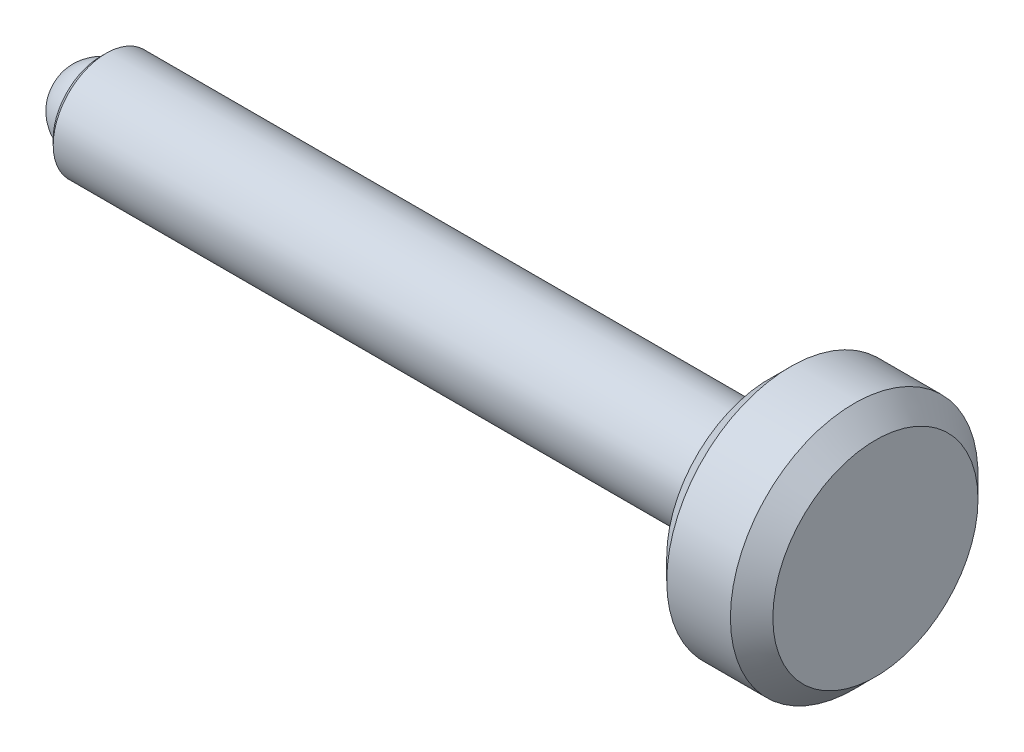
ISO-10303-21;
HEADER;
FILE_DESCRIPTION(('STEP AP214'),'2;1');
FILE_NAME('part.step','',(''),(''),'','','');
FILE_SCHEMA(('AUTOMOTIVE_DESIGN { 1 0 10303 214 1 1 1 1 }'));
ENDSEC;
DATA;
#1=APPLICATION_CONTEXT('core data for automotive mechanical design processes');
#2=APPLICATION_PROTOCOL_DEFINITION('international standard','automotive_design',2000,#1);
#3=PRODUCT_CONTEXT('',#1,'mechanical');
#4=PRODUCT('Part','Part','',(#3));
#5=PRODUCT_RELATED_PRODUCT_CATEGORY('part','',(#4));
#6=PRODUCT_DEFINITION_FORMATION('','',#4);
#7=PRODUCT_DEFINITION_CONTEXT('part definition',#1,'design');
#8=PRODUCT_DEFINITION('design','',#6,#7);
#9=PRODUCT_DEFINITION_SHAPE('','',#8);
#10=(LENGTH_UNIT() NAMED_UNIT(*) SI_UNIT(.MILLI.,.METRE.));
#11=(NAMED_UNIT(*) PLANE_ANGLE_UNIT() SI_UNIT($,.RADIAN.));
#12=(NAMED_UNIT(*) SI_UNIT($,.STERADIAN.) SOLID_ANGLE_UNIT());
#13=UNCERTAINTY_MEASURE_WITH_UNIT(LENGTH_MEASURE(1.E-05),#10,'distance_accuracy_value','');
#14=(GEOMETRIC_REPRESENTATION_CONTEXT(3) GLOBAL_UNCERTAINTY_ASSIGNED_CONTEXT((#13)) GLOBAL_UNIT_ASSIGNED_CONTEXT((#10,
#11,#12)) REPRESENTATION_CONTEXT('',''));
#15=CARTESIAN_POINT('',(0.,0.,0.));
#16=DIRECTION('',(0.,0.,1.));
#17=DIRECTION('',(1.,0.,0.));
#18=AXIS2_PLACEMENT_3D('',#15,#16,#17);
#19=CARTESIAN_POINT('',(1.1,0.,0.));
#20=DIRECTION('',(-1.,0.,0.));
#21=DIRECTION('',(0.,1.,0.));
#22=AXIS2_PLACEMENT_3D('',#19,#20,#21);
#23=SPHERICAL_SURFACE('',#22,1.1);
#24=CARTESIAN_POINT('',(1.1,0.,0.));
#25=DIRECTION('',(-1.,0.,0.));
#26=DIRECTION('',(0.,0.,1.));
#27=AXIS2_PLACEMENT_3D('',#24,#25,#26);
#28=CIRCLE('',#27,1.1);
#29=CARTESIAN_POINT('',(1.1,0.,1.1));
#30=VERTEX_POINT('',#29);
#31=EDGE_CURVE('E10',#30,#30,#28,.T.);
#32=ORIENTED_EDGE('',*,*,#31,.T.);
#33=EDGE_LOOP('',(#32));
#34=FACE_BOUND('',#33,.T.);
#35=ADVANCED_FACE('F35',(#34),#23,.T.);
#36=CARTESIAN_POINT('',(1.1,1.1,0.));
#37=DIRECTION('',(1.,0.,0.));
#38=DIRECTION('',(0.,0.,-1.));
#39=AXIS2_PLACEMENT_3D('',#36,#37,#38);
#40=PLANE('',#39);
#41=ORIENTED_EDGE('',*,*,#31,.F.);
#42=EDGE_LOOP('',(#41));
#43=FACE_BOUND('',#42,.T.);
#44=CARTESIAN_POINT('',(1.1,0.,0.));
#45=DIRECTION('',(-1.,0.,0.));
#46=DIRECTION('',(0.,0.,1.));
#47=AXIS2_PLACEMENT_3D('',#44,#45,#46);
#48=CIRCLE('',#47,1.3465);
#49=CARTESIAN_POINT('',(1.1,0.,1.3465));
#50=VERTEX_POINT('',#49);
#51=EDGE_CURVE('E41',#50,#50,#48,.T.);
#52=ORIENTED_EDGE('',*,*,#51,.T.);
#53=EDGE_LOOP('',(#52));
#54=FACE_BOUND('',#53,.T.);
#55=ADVANCED_FACE('F85',(#43,#54),#40,.F.);
#56=CARTESIAN_POINT('',(1.2535,0.,0.));
#57=DIRECTION('',(1.,0.,0.));
#58=DIRECTION('',(0.,0.,-1.));
#59=AXIS2_PLACEMENT_3D('',#56,#57,#58);
#60=CONICAL_SURFACE('',#59,1.5,0.785398163397446);
#61=ORIENTED_EDGE('',*,*,#51,.F.);
#62=EDGE_LOOP('',(#61));
#63=FACE_BOUND('',#62,.T.);
#64=CARTESIAN_POINT('',(1.2535,0.,0.));
#65=DIRECTION('',(-1.,0.,0.));
#66=DIRECTION('',(0.,0.,1.));
#67=AXIS2_PLACEMENT_3D('',#64,#65,#66);
#68=CIRCLE('',#67,1.5);
#69=CARTESIAN_POINT('',(1.2535,0.,1.5));
#70=VERTEX_POINT('',#69);
#71=EDGE_CURVE('E45',#70,#70,#68,.T.);
#72=ORIENTED_EDGE('',*,*,#71,.T.);
#73=EDGE_LOOP('',(#72));
#74=FACE_BOUND('',#73,.T.);
#75=ADVANCED_FACE('F89',(#63,#74),#60,.T.);
#76=CARTESIAN_POINT('',(23.,0.,0.));
#77=DIRECTION('',(-1.,0.,0.));
#78=DIRECTION('',(0.,0.,1.));
#79=AXIS2_PLACEMENT_3D('',#76,#77,#78);
#80=CYLINDRICAL_SURFACE('',#79,1.5);
#81=ORIENTED_EDGE('',*,*,#71,.F.);
#82=EDGE_LOOP('',(#81));
#83=FACE_BOUND('',#82,.T.);
#84=CARTESIAN_POINT('',(19.1,0.,0.));
#85=DIRECTION('',(-1.,0.,0.));
#86=DIRECTION('',(0.,0.,1.));
#87=AXIS2_PLACEMENT_3D('',#84,#85,#86);
#88=CIRCLE('',#87,1.5);
#89=CARTESIAN_POINT('',(19.1,0.,1.5));
#90=VERTEX_POINT('',#89);
#91=EDGE_CURVE('E49',#90,#90,#88,.T.);
#92=ORIENTED_EDGE('',*,*,#91,.T.);
#93=EDGE_LOOP('',(#92));
#94=FACE_BOUND('',#93,.T.);
#95=ADVANCED_FACE('F94',(#83,#94),#80,.T.);
#96=CARTESIAN_POINT('',(19.1,1.5,0.));
#97=DIRECTION('',(-1.,0.,0.));
#98=DIRECTION('',(0.,0.,1.));
#99=AXIS2_PLACEMENT_3D('',#96,#97,#98);
#100=PLANE('',#99);
#101=ORIENTED_EDGE('',*,*,#91,.F.);
#102=EDGE_LOOP('',(#101));
#103=FACE_BOUND('',#102,.T.);
#104=CARTESIAN_POINT('',(19.1,0.,0.));
#105=DIRECTION('',(-1.,0.,0.));
#106=DIRECTION('',(0.,0.,1.));
#107=AXIS2_PLACEMENT_3D('',#104,#105,#106);
#108=CIRCLE('',#107,1.3465);
#109=CARTESIAN_POINT('',(19.1,0.,1.3465));
#110=VERTEX_POINT('',#109);
#111=EDGE_CURVE('E54',#110,#110,#108,.T.);
#112=ORIENTED_EDGE('',*,*,#111,.T.);
#113=EDGE_LOOP('',(#112));
#114=FACE_BOUND('',#113,.T.);
#115=ADVANCED_FACE('F100',(#103,#114),#100,.F.);
#116=CARTESIAN_POINT('',(23.,0.,0.));
#117=DIRECTION('',(-1.,0.,0.));
#118=DIRECTION('',(0.,0.,1.));
#119=AXIS2_PLACEMENT_3D('',#116,#117,#118);
#120=CYLINDRICAL_SURFACE('',#119,1.3465);
#121=ORIENTED_EDGE('',*,*,#111,.F.);
#122=EDGE_LOOP('',(#121));
#123=FACE_BOUND('',#122,.T.);
#124=CARTESIAN_POINT('',(20.,0.,0.));
#125=DIRECTION('',(-1.,0.,0.));
#126=DIRECTION('',(0.,0.,1.));
#127=AXIS2_PLACEMENT_3D('',#124,#125,#126);
#128=CIRCLE('',#127,1.3465);
#129=CARTESIAN_POINT('',(20.,0.,1.3465));
#130=VERTEX_POINT('',#129);
#131=EDGE_CURVE('E57',#130,#130,#128,.T.);
#132=ORIENTED_EDGE('',*,*,#131,.T.);
#133=EDGE_LOOP('',(#132));
#134=FACE_BOUND('',#133,.T.);
#135=ADVANCED_FACE('F104',(#123,#134),#120,.T.);
#136=CARTESIAN_POINT('',(20.,1.3465,0.));
#137=DIRECTION('',(1.,0.,0.));
#138=DIRECTION('',(0.,0.,-1.));
#139=AXIS2_PLACEMENT_3D('',#136,#137,#138);
#140=PLANE('',#139);
#141=ORIENTED_EDGE('',*,*,#131,.F.);
#142=EDGE_LOOP('',(#141));
#143=FACE_BOUND('',#142,.T.);
#144=CARTESIAN_POINT('',(20.,0.,0.));
#145=DIRECTION('',(-1.,0.,0.));
#146=DIRECTION('',(0.,0.,1.));
#147=AXIS2_PLACEMENT_3D('',#144,#145,#146);
#148=CIRCLE('',#147,2.9);
#149=CARTESIAN_POINT('',(20.,0.,2.9));
#150=VERTEX_POINT('',#149);
#151=EDGE_CURVE('E60',#150,#150,#148,.T.);
#152=ORIENTED_EDGE('',*,*,#151,.T.);
#153=EDGE_LOOP('',(#152));
#154=FACE_BOUND('',#153,.T.);
#155=ADVANCED_FACE('F108',(#143,#154),#140,.F.);
#156=CARTESIAN_POINT('',(20.6,0.,0.));
#157=DIRECTION('',(1.,0.,0.));
#158=DIRECTION('',(0.,0.,-1.));
#159=AXIS2_PLACEMENT_3D('',#156,#157,#158);
#160=CONICAL_SURFACE('',#159,3.5,0.785398163397449);
#161=ORIENTED_EDGE('',*,*,#151,.F.);
#162=EDGE_LOOP('',(#161));
#163=FACE_BOUND('',#162,.T.);
#164=CARTESIAN_POINT('',(20.6,0.,0.));
#165=DIRECTION('',(-1.,0.,0.));
#166=DIRECTION('',(0.,0.,1.));
#167=AXIS2_PLACEMENT_3D('',#164,#165,#166);
#168=CIRCLE('',#167,3.5);
#169=CARTESIAN_POINT('',(20.6,0.,3.5));
#170=VERTEX_POINT('',#169);
#171=EDGE_CURVE('E63',#170,#170,#168,.T.);
#172=ORIENTED_EDGE('',*,*,#171,.T.);
#173=EDGE_LOOP('',(#172));
#174=FACE_BOUND('',#173,.T.);
#175=ADVANCED_FACE('F112',(#163,#174),#160,.T.);
#176=CARTESIAN_POINT('',(23.,0.,0.));
#177=DIRECTION('',(-1.,0.,0.));
#178=DIRECTION('',(0.,0.,1.));
#179=AXIS2_PLACEMENT_3D('',#176,#177,#178);
#180=CYLINDRICAL_SURFACE('',#179,3.5);
#181=ORIENTED_EDGE('',*,*,#171,.F.);
#182=EDGE_LOOP('',(#181));
#183=FACE_BOUND('',#182,.T.);
#184=CARTESIAN_POINT('',(22.4,0.,0.));
#185=DIRECTION('',(-1.,0.,0.));
#186=DIRECTION('',(0.,0.,1.));
#187=AXIS2_PLACEMENT_3D('',#184,#185,#186);
#188=CIRCLE('',#187,3.5);
#189=CARTESIAN_POINT('',(22.4,0.,3.5));
#190=VERTEX_POINT('',#189);
#191=EDGE_CURVE('E66',#190,#190,#188,.T.);
#192=ORIENTED_EDGE('',*,*,#191,.T.);
#193=EDGE_LOOP('',(#192));
#194=FACE_BOUND('',#193,.T.);
#195=ADVANCED_FACE('F81',(#183,#194),#180,.T.);
#196=CARTESIAN_POINT('',(23.,0.,0.));
#197=DIRECTION('',(-1.,0.,0.));
#198=DIRECTION('',(0.,0.,1.));
#199=AXIS2_PLACEMENT_3D('',#196,#197,#198);
#200=CONICAL_SURFACE('',#199,2.9,0.785398163397449);
#201=ORIENTED_EDGE('',*,*,#191,.F.);
#202=EDGE_LOOP('',(#201));
#203=FACE_BOUND('',#202,.T.);
#204=CARTESIAN_POINT('',(23.,0.,0.));
#205=DIRECTION('',(-1.,0.,0.));
#206=DIRECTION('',(0.,0.,1.));
#207=AXIS2_PLACEMENT_3D('',#204,#205,#206);
#208=CIRCLE('',#207,2.9);
#209=CARTESIAN_POINT('',(23.,0.,2.9));
#210=VERTEX_POINT('',#209);
#211=EDGE_CURVE('E69',#210,#210,#208,.T.);
#212=ORIENTED_EDGE('',*,*,#211,.T.);
#213=EDGE_LOOP('',(#212));
#214=FACE_BOUND('',#213,.T.);
#215=ADVANCED_FACE('F73',(#203,#214),#200,.T.);
#216=CARTESIAN_POINT('',(23.,2.9,0.));
#217=DIRECTION('',(-1.,0.,0.));
#218=DIRECTION('',(0.,0.,1.));
#219=AXIS2_PLACEMENT_3D('',#216,#217,#218);
#220=PLANE('',#219);
#221=ORIENTED_EDGE('',*,*,#211,.F.);
#222=EDGE_LOOP('',(#221));
#223=FACE_BOUND('',#222,.T.);
#224=ADVANCED_FACE('F75',(#223),#220,.F.);
#225=CLOSED_SHELL('',(#35,#55,#75,#95,#115,#135,#155,#175,#195,#215,#224));
#226=MANIFOLD_SOLID_BREP('B2',#225);
#227=ADVANCED_BREP_SHAPE_REPRESENTATION('',(#18,#226),#14);
#228=SHAPE_DEFINITION_REPRESENTATION(#9,#227);
ENDSEC;
END-ISO-10303-21;
